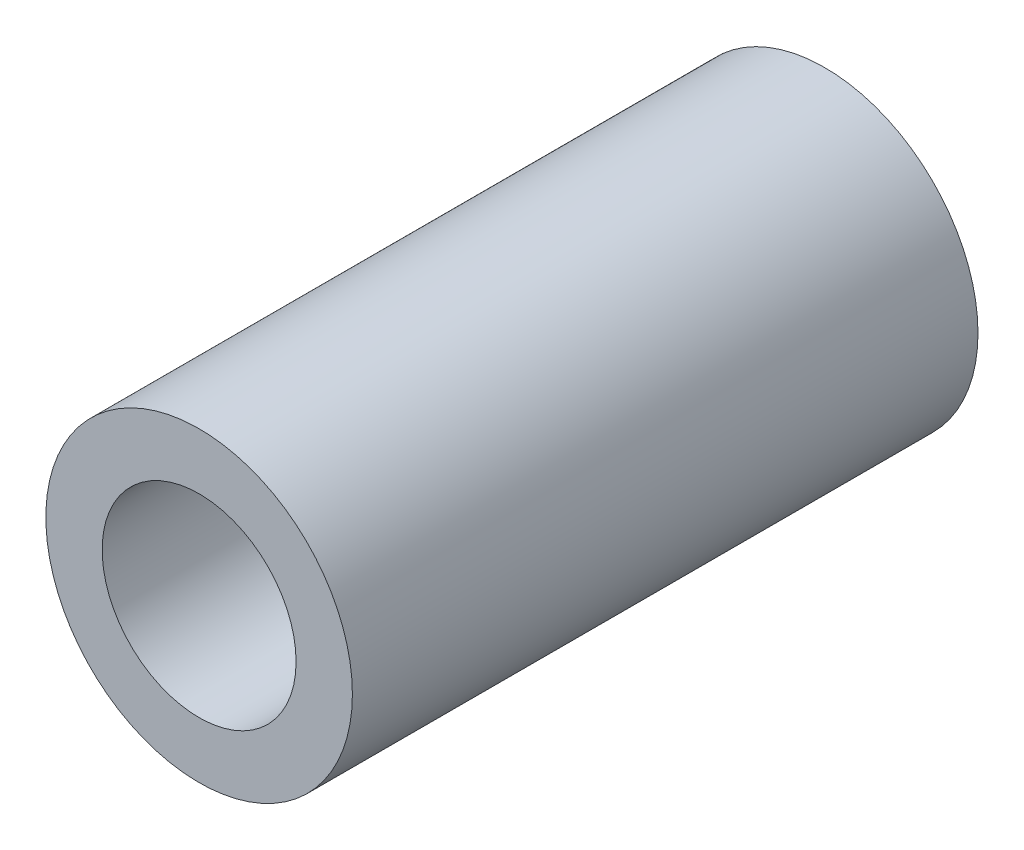
ISO-10303-21;
HEADER;
FILE_DESCRIPTION(('STEP AP214'),'2;1');
FILE_NAME('part.step','',(''),(''),'','','');
FILE_SCHEMA(('AUTOMOTIVE_DESIGN { 1 0 10303 214 1 1 1 1 }'));
ENDSEC;
DATA;
#1=APPLICATION_CONTEXT('core data for automotive mechanical design processes');
#2=APPLICATION_PROTOCOL_DEFINITION('international standard','automotive_design',2000,#1);
#3=PRODUCT_CONTEXT('',#1,'mechanical');
#4=PRODUCT('Part','Part','',(#3));
#5=PRODUCT_RELATED_PRODUCT_CATEGORY('part','',(#4));
#6=PRODUCT_DEFINITION_FORMATION('','',#4);
#7=PRODUCT_DEFINITION_CONTEXT('part definition',#1,'design');
#8=PRODUCT_DEFINITION('design','',#6,#7);
#9=PRODUCT_DEFINITION_SHAPE('','',#8);
#10=(LENGTH_UNIT() NAMED_UNIT(*) SI_UNIT(.MILLI.,.METRE.));
#11=(NAMED_UNIT(*) PLANE_ANGLE_UNIT() SI_UNIT($,.RADIAN.));
#12=(NAMED_UNIT(*) SI_UNIT($,.STERADIAN.) SOLID_ANGLE_UNIT());
#13=UNCERTAINTY_MEASURE_WITH_UNIT(LENGTH_MEASURE(1.E-05),#10,'distance_accuracy_value','');
#14=(GEOMETRIC_REPRESENTATION_CONTEXT(3) GLOBAL_UNCERTAINTY_ASSIGNED_CONTEXT((#13)) GLOBAL_UNIT_ASSIGNED_CONTEXT((#10,
#11,#12)) REPRESENTATION_CONTEXT('',''));
#15=CARTESIAN_POINT('',(0.,0.,0.));
#16=DIRECTION('',(0.,0.,1.));
#17=DIRECTION('',(1.,0.,0.));
#18=AXIS2_PLACEMENT_3D('',#15,#16,#17);
#19=CARTESIAN_POINT('',(0.,0.,20.));
#20=DIRECTION('',(0.,0.,1.));
#21=DIRECTION('',(1.,0.,0.));
#22=AXIS2_PLACEMENT_3D('',#19,#20,#21);
#23=PLANE('',#22);
#24=CARTESIAN_POINT('',(0.,0.,20.));
#25=DIRECTION('',(0.,0.,1.));
#26=DIRECTION('',(1.,0.,0.));
#27=AXIS2_PLACEMENT_3D('',#24,#25,#26);
#28=CIRCLE('',#27,4.9);
#29=CARTESIAN_POINT('',(4.9,0.,20.));
#30=VERTEX_POINT('',#29);
#31=EDGE_CURVE('E10',#30,#30,#28,.T.);
#32=ORIENTED_EDGE('',*,*,#31,.T.);
#33=EDGE_LOOP('',(#32));
#34=FACE_BOUND('',#33,.T.);
#35=CARTESIAN_POINT('',(0.,0.,20.));
#36=DIRECTION('',(0.,0.,1.));
#37=DIRECTION('',(1.,0.,0.));
#38=AXIS2_PLACEMENT_3D('',#35,#36,#37);
#39=CIRCLE('',#38,3.1);
#40=CARTESIAN_POINT('',(3.1,0.,20.));
#41=VERTEX_POINT('',#40);
#42=EDGE_CURVE('E46',#41,#41,#39,.T.);
#43=ORIENTED_EDGE('',*,*,#42,.F.);
#44=EDGE_LOOP('',(#43));
#45=FACE_BOUND('',#44,.T.);
#46=ADVANCED_FACE('F35',(#34,#45),#23,.T.);
#47=CARTESIAN_POINT('',(0.,0.,0.));
#48=DIRECTION('',(0.,0.,1.));
#49=DIRECTION('',(1.,0.,0.));
#50=AXIS2_PLACEMENT_3D('',#47,#48,#49);
#51=PLANE('',#50);
#52=CARTESIAN_POINT('',(0.,0.,0.));
#53=DIRECTION('',(0.,0.,1.));
#54=DIRECTION('',(1.,0.,0.));
#55=AXIS2_PLACEMENT_3D('',#52,#53,#54);
#56=CIRCLE('',#55,4.9);
#57=CARTESIAN_POINT('',(4.9,0.,0.));
#58=VERTEX_POINT('',#57);
#59=EDGE_CURVE('E39',#58,#58,#56,.T.);
#60=ORIENTED_EDGE('',*,*,#59,.F.);
#61=EDGE_LOOP('',(#60));
#62=FACE_BOUND('',#61,.T.);
#63=CARTESIAN_POINT('',(0.,0.,0.));
#64=DIRECTION('',(0.,0.,1.));
#65=DIRECTION('',(1.,0.,0.));
#66=AXIS2_PLACEMENT_3D('',#63,#64,#65);
#67=CIRCLE('',#66,3.1);
#68=CARTESIAN_POINT('',(3.1,0.,0.));
#69=VERTEX_POINT('',#68);
#70=EDGE_CURVE('E48',#69,#69,#67,.T.);
#71=ORIENTED_EDGE('',*,*,#70,.T.);
#72=EDGE_LOOP('',(#71));
#73=FACE_BOUND('',#72,.T.);
#74=ADVANCED_FACE('F58',(#62,#73),#51,.F.);
#75=CARTESIAN_POINT('',(0.,0.,20.));
#76=DIRECTION('',(0.,0.,-1.));
#77=DIRECTION('',(-1.,0.,0.));
#78=AXIS2_PLACEMENT_3D('',#75,#76,#77);
#79=CYLINDRICAL_SURFACE('',#78,4.9);
#80=ORIENTED_EDGE('',*,*,#31,.F.);
#81=EDGE_LOOP('',(#80));
#82=FACE_BOUND('',#81,.T.);
#83=ORIENTED_EDGE('',*,*,#59,.T.);
#84=EDGE_LOOP('',(#83));
#85=FACE_BOUND('',#84,.T.);
#86=ADVANCED_FACE('F37',(#82,#85),#79,.T.);
#87=CARTESIAN_POINT('',(0.,0.,20.));
#88=DIRECTION('',(0.,0.,-1.));
#89=DIRECTION('',(-1.,0.,0.));
#90=AXIS2_PLACEMENT_3D('',#87,#88,#89);
#91=CYLINDRICAL_SURFACE('',#90,3.1);
#92=ORIENTED_EDGE('',*,*,#42,.T.);
#93=EDGE_LOOP('',(#92));
#94=FACE_BOUND('',#93,.T.);
#95=ORIENTED_EDGE('',*,*,#70,.F.);
#96=EDGE_LOOP('',(#95));
#97=FACE_BOUND('',#96,.T.);
#98=ADVANCED_FACE('F54',(#94,#97),#91,.F.);
#99=CLOSED_SHELL('',(#46,#74,#86,#98));
#100=MANIFOLD_SOLID_BREP('B2',#99);
#101=ADVANCED_BREP_SHAPE_REPRESENTATION('',(#18,#100),#14);
#102=SHAPE_DEFINITION_REPRESENTATION(#9,#101);
ENDSEC;
END-ISO-10303-21;
